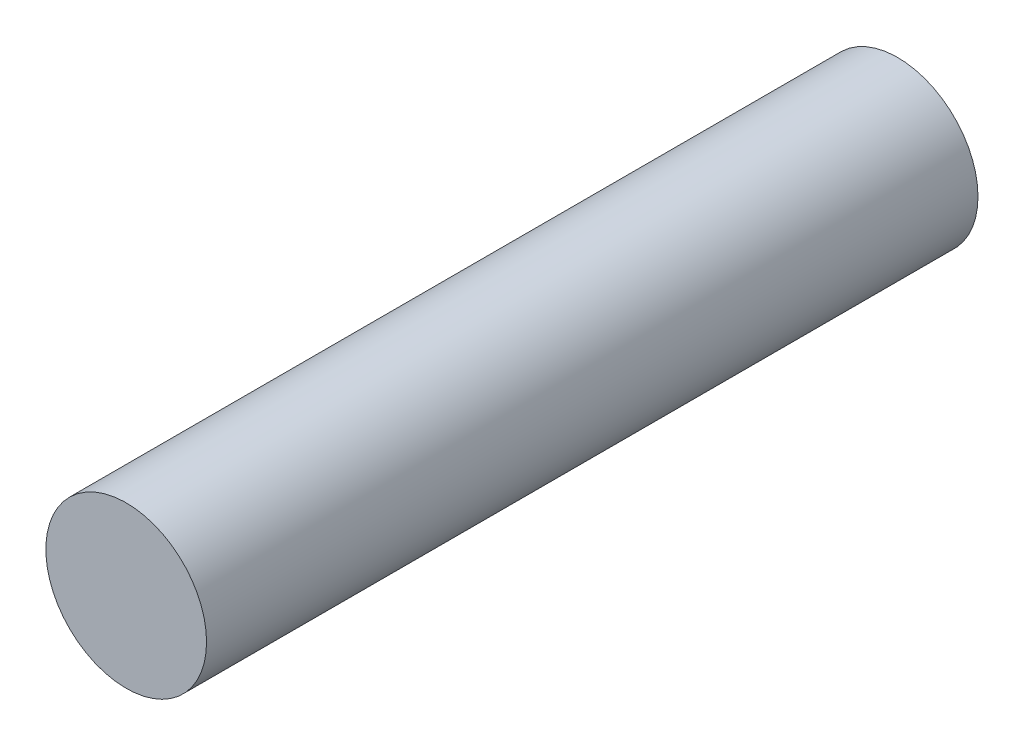
ISO-10303-21;
HEADER;
FILE_DESCRIPTION(('STEP AP214'),'2;1');
FILE_NAME('part.step','',(''),(''),'','','');
FILE_SCHEMA(('AUTOMOTIVE_DESIGN { 1 0 10303 214 1 1 1 1 }'));
ENDSEC;
DATA;
#1=APPLICATION_CONTEXT('core data for automotive mechanical design processes');
#2=APPLICATION_PROTOCOL_DEFINITION('international standard','automotive_design',2000,#1);
#3=PRODUCT_CONTEXT('',#1,'mechanical');
#4=PRODUCT('Part','Part','',(#3));
#5=PRODUCT_RELATED_PRODUCT_CATEGORY('part','',(#4));
#6=PRODUCT_DEFINITION_FORMATION('','',#4);
#7=PRODUCT_DEFINITION_CONTEXT('part definition',#1,'design');
#8=PRODUCT_DEFINITION('design','',#6,#7);
#9=PRODUCT_DEFINITION_SHAPE('','',#8);
#10=(LENGTH_UNIT() NAMED_UNIT(*) SI_UNIT(.MILLI.,.METRE.));
#11=(NAMED_UNIT(*) PLANE_ANGLE_UNIT() SI_UNIT($,.RADIAN.));
#12=(NAMED_UNIT(*) SI_UNIT($,.STERADIAN.) SOLID_ANGLE_UNIT());
#13=UNCERTAINTY_MEASURE_WITH_UNIT(LENGTH_MEASURE(1.E-05),#10,'distance_accuracy_value','');
#14=(GEOMETRIC_REPRESENTATION_CONTEXT(3) GLOBAL_UNCERTAINTY_ASSIGNED_CONTEXT((#13)) GLOBAL_UNIT_ASSIGNED_CONTEXT((#10,
#11,#12)) REPRESENTATION_CONTEXT('',''));
#15=CARTESIAN_POINT('',(0.,0.,0.));
#16=DIRECTION('',(0.,0.,1.));
#17=DIRECTION('',(1.,0.,0.));
#18=AXIS2_PLACEMENT_3D('',#15,#16,#17);
#19=CARTESIAN_POINT('',(0.,0.,24.));
#20=DIRECTION('',(0.,0.,-1.));
#21=DIRECTION('',(-1.,0.,0.));
#22=AXIS2_PLACEMENT_3D('',#19,#20,#21);
#23=CYLINDRICAL_SURFACE('',#22,2.5);
#24=CARTESIAN_POINT('',(0.,0.,24.));
#25=DIRECTION('',(0.,0.,1.));
#26=DIRECTION('',(1.,0.,0.));
#27=AXIS2_PLACEMENT_3D('',#24,#25,#26);
#28=CIRCLE('',#27,2.5);
#29=CARTESIAN_POINT('',(2.5,0.,24.));
#30=VERTEX_POINT('',#29);
#31=EDGE_CURVE('E10',#30,#30,#28,.T.);
#32=ORIENTED_EDGE('',*,*,#31,.F.);
#33=EDGE_LOOP('',(#32));
#34=FACE_BOUND('',#33,.T.);
#35=CARTESIAN_POINT('',(0.,0.,0.));
#36=DIRECTION('',(0.,0.,1.));
#37=DIRECTION('',(1.,0.,0.));
#38=AXIS2_PLACEMENT_3D('',#35,#36,#37);
#39=CIRCLE('',#38,2.5);
#40=CARTESIAN_POINT('',(2.5,0.,0.));
#41=VERTEX_POINT('',#40);
#42=EDGE_CURVE('E36',#41,#41,#39,.T.);
#43=ORIENTED_EDGE('',*,*,#42,.T.);
#44=EDGE_LOOP('',(#43));
#45=FACE_BOUND('',#44,.T.);
#46=ADVANCED_FACE('F33',(#34,#45),#23,.T.);
#47=CARTESIAN_POINT('',(0.,0.,24.));
#48=DIRECTION('',(0.,0.,1.));
#49=DIRECTION('',(1.,0.,0.));
#50=AXIS2_PLACEMENT_3D('',#47,#48,#49);
#51=PLANE('',#50);
#52=ORIENTED_EDGE('',*,*,#31,.T.);
#53=EDGE_LOOP('',(#52));
#54=FACE_BOUND('',#53,.T.);
#55=ADVANCED_FACE('F48',(#54),#51,.T.);
#56=CARTESIAN_POINT('',(0.,0.,0.));
#57=DIRECTION('',(0.,0.,1.));
#58=DIRECTION('',(1.,0.,0.));
#59=AXIS2_PLACEMENT_3D('',#56,#57,#58);
#60=PLANE('',#59);
#61=ORIENTED_EDGE('',*,*,#42,.F.);
#62=EDGE_LOOP('',(#61));
#63=FACE_BOUND('',#62,.T.);
#64=ADVANCED_FACE('F46',(#63),#60,.F.);
#65=CLOSED_SHELL('',(#46,#55,#64));
#66=MANIFOLD_SOLID_BREP('B2',#65);
#67=ADVANCED_BREP_SHAPE_REPRESENTATION('',(#18,#66),#14);
#68=SHAPE_DEFINITION_REPRESENTATION(#9,#67);
ENDSEC;
END-ISO-10303-21;
